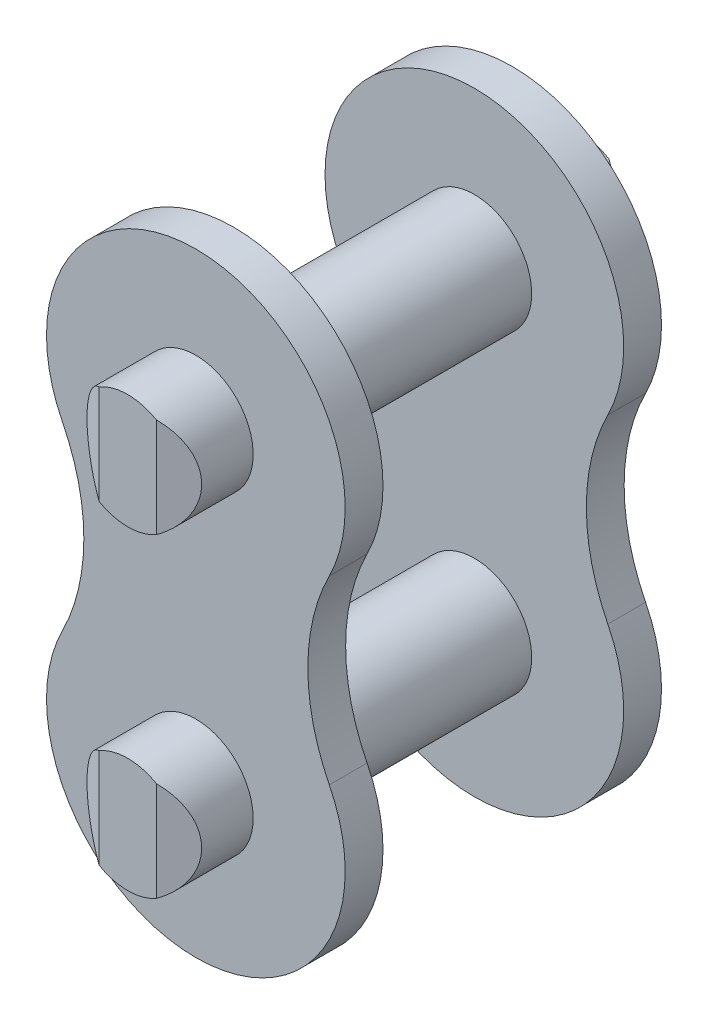
ISO-10303-21;
HEADER;
FILE_DESCRIPTION(('STEP AP214'),'2;1');
FILE_NAME('part.step','',(''),(''),'','','');
FILE_SCHEMA(('AUTOMOTIVE_DESIGN { 1 0 10303 214 1 1 1 1 }'));
ENDSEC;
DATA;
#1=APPLICATION_CONTEXT('core data for automotive mechanical design processes');
#2=APPLICATION_PROTOCOL_DEFINITION('international standard','automotive_design',2000,#1);
#3=PRODUCT_CONTEXT('',#1,'mechanical');
#4=PRODUCT('Part','Part','',(#3));
#5=PRODUCT_RELATED_PRODUCT_CATEGORY('part','',(#4));
#6=PRODUCT_DEFINITION_FORMATION('','',#4);
#7=PRODUCT_DEFINITION_CONTEXT('part definition',#1,'design');
#8=PRODUCT_DEFINITION('design','',#6,#7);
#9=PRODUCT_DEFINITION_SHAPE('','',#8);
#10=(LENGTH_UNIT() NAMED_UNIT(*) SI_UNIT(.MILLI.,.METRE.));
#11=(NAMED_UNIT(*) PLANE_ANGLE_UNIT() SI_UNIT($,.RADIAN.));
#12=(NAMED_UNIT(*) SI_UNIT($,.STERADIAN.) SOLID_ANGLE_UNIT());
#13=UNCERTAINTY_MEASURE_WITH_UNIT(LENGTH_MEASURE(1.E-05),#10,'distance_accuracy_value','');
#14=(GEOMETRIC_REPRESENTATION_CONTEXT(3) GLOBAL_UNCERTAINTY_ASSIGNED_CONTEXT((#13)) GLOBAL_UNIT_ASSIGNED_CONTEXT((#10,
#11,#12)) REPRESENTATION_CONTEXT('',''));
#15=CARTESIAN_POINT('',(0.,0.,0.));
#16=DIRECTION('',(0.,0.,1.));
#17=DIRECTION('',(1.,0.,0.));
#18=AXIS2_PLACEMENT_3D('',#15,#16,#17);
#19=CARTESIAN_POINT('',(133.975475000006,224.252155414286,-131.392489073474));
#20=DIRECTION('',(-0.5,0.,0.866025403784439));
#21=DIRECTION('',(0.,1.,0.));
#22=AXIS2_PLACEMENT_3D('',#19,#20,#21);
#23=PLANE('',#22);
#24=CARTESIAN_POINT('',(133.108700000007,209.749496563336,-131.892921853051));
#25=DIRECTION('',(0.5,0.,-0.866025403784439));
#26=DIRECTION('',(0.866025403784439,0.,0.5));
#27=AXIS2_PLACEMENT_3D('',#24,#25,#26);
#28=ELLIPSE('',#27,1.3344874122049,1.1557);
#29=CARTESIAN_POINT('',(133.686550000007,210.750362122491,-131.5593));
#30=VERTEX_POINT('',#29);
#31=CARTESIAN_POINT('',(133.686550000007,208.748631004183,-131.5593));
#32=VERTEX_POINT('',#31);
#33=EDGE_CURVE('E291',#30,#32,#28,.T.);
#34=ORIENTED_EDGE('',*,*,#33,.T.);
#35=DIRECTION('',(0.,-1.,0.));
#36=VECTOR('',#35,1.);
#37=CARTESIAN_POINT('',(133.686550000007,224.252155414286,-131.5593));
#38=LINE('',#37,#36);
#39=EDGE_CURVE('E245',#30,#32,#38,.T.);
#40=ORIENTED_EDGE('',*,*,#39,.F.);
#41=EDGE_LOOP('',(#34,#40));
#42=FACE_BOUND('',#41,.T.);
#43=ADVANCED_FACE('F17',(#42),#23,.F.);
#44=CARTESIAN_POINT('',(132.241925000006,224.252155414286,-131.392489073474));
#45=DIRECTION('',(-0.5,0.,-0.866025403784439));
#46=DIRECTION('',(-0.866025403784439,0.,0.5));
#47=AXIS2_PLACEMENT_3D('',#44,#45,#46);
#48=PLANE('',#47);
#49=CARTESIAN_POINT('',(133.108700000007,209.749496563336,-131.892921853051));
#50=DIRECTION('',(0.5,0.,0.866025403784439));
#51=DIRECTION('',(-0.866025403784439,0.,0.5));
#52=AXIS2_PLACEMENT_3D('',#49,#50,#51);
#53=ELLIPSE('',#52,1.3344874122049,1.1557);
#54=CARTESIAN_POINT('',(132.530850000007,210.750362122491,-131.5593));
#55=VERTEX_POINT('',#54);
#56=CARTESIAN_POINT('',(132.530850000007,208.748631004183,-131.5593));
#57=VERTEX_POINT('',#56);
#58=EDGE_CURVE('E299',#55,#57,#53,.T.);
#59=ORIENTED_EDGE('',*,*,#58,.F.);
#60=DIRECTION('',(0.,-1.,0.));
#61=VECTOR('',#60,1.);
#62=CARTESIAN_POINT('',(132.530850000007,224.252155414286,-131.5593));
#63=LINE('',#62,#61);
#64=EDGE_CURVE('E248',#55,#57,#63,.T.);
#65=ORIENTED_EDGE('',*,*,#64,.T.);
#66=EDGE_LOOP('',(#59,#65));
#67=FACE_BOUND('',#66,.T.);
#68=ADVANCED_FACE('F387',(#67),#48,.T.);
#69=CARTESIAN_POINT('',(133.975475000006,224.252155414286,-131.392489073474));
#70=DIRECTION('',(-0.5,0.,0.866025403784439));
#71=DIRECTION('',(0.,1.,0.));
#72=AXIS2_PLACEMENT_3D('',#69,#70,#71);
#73=PLANE('',#72);
#74=CARTESIAN_POINT('',(133.108700000007,203.399496563337,-131.892921853051));
#75=DIRECTION('',(0.5,0.,-0.866025403784439));
#76=DIRECTION('',(0.866025403784439,0.,0.5));
#77=AXIS2_PLACEMENT_3D('',#74,#75,#76);
#78=ELLIPSE('',#77,1.3344874122049,1.1557);
#79=CARTESIAN_POINT('',(133.686550000007,204.400362122491,-131.5593));
#80=VERTEX_POINT('',#79);
#81=CARTESIAN_POINT('',(133.686550000007,202.398631004183,-131.5593));
#82=VERTEX_POINT('',#81);
#83=EDGE_CURVE('E309',#80,#82,#78,.T.);
#84=ORIENTED_EDGE('',*,*,#83,.T.);
#85=DIRECTION('',(0.,-1.,0.));
#86=VECTOR('',#85,1.);
#87=CARTESIAN_POINT('',(133.686550000007,224.252155414286,-131.5593));
#88=LINE('',#87,#86);
#89=EDGE_CURVE('E319',#80,#82,#88,.T.);
#90=ORIENTED_EDGE('',*,*,#89,.F.);
#91=EDGE_LOOP('',(#84,#90));
#92=FACE_BOUND('',#91,.T.);
#93=ADVANCED_FACE('F393',(#92),#73,.F.);
#94=CARTESIAN_POINT('',(132.241925000006,224.252155414286,-131.392489073474));
#95=DIRECTION('',(-0.5,0.,-0.866025403784439));
#96=DIRECTION('',(-0.866025403784439,0.,0.5));
#97=AXIS2_PLACEMENT_3D('',#94,#95,#96);
#98=PLANE('',#97);
#99=CARTESIAN_POINT('',(133.108700000007,203.399496563337,-131.892921853051));
#100=DIRECTION('',(0.5,0.,0.866025403784439));
#101=DIRECTION('',(-0.866025403784439,0.,0.5));
#102=AXIS2_PLACEMENT_3D('',#99,#100,#101);
#103=ELLIPSE('',#102,1.3344874122049,1.1557);
#104=CARTESIAN_POINT('',(132.530850000007,204.400362122491,-131.5593));
#105=VERTEX_POINT('',#104);
#106=CARTESIAN_POINT('',(132.530850000007,202.398631004183,-131.5593));
#107=VERTEX_POINT('',#106);
#108=EDGE_CURVE('E310',#105,#107,#103,.T.);
#109=ORIENTED_EDGE('',*,*,#108,.F.);
#110=DIRECTION('',(0.,-1.,0.));
#111=VECTOR('',#110,1.);
#112=CARTESIAN_POINT('',(132.530850000007,224.252155414286,-131.5593));
#113=LINE('',#112,#111);
#114=EDGE_CURVE('E322',#105,#107,#113,.T.);
#115=ORIENTED_EDGE('',*,*,#114,.T.);
#116=EDGE_LOOP('',(#109,#115));
#117=FACE_BOUND('',#116,.T.);
#118=ADVANCED_FACE('F382',(#117),#98,.T.);
#119=CARTESIAN_POINT('',(133.108700000007,206.574496563337,-129.4257));
#120=DIRECTION('',(0.,0.,-1.));
#121=DIRECTION('',(0.,-1.,0.));
#122=AXIS2_PLACEMENT_3D('',#119,#120,#121);
#123=PLANE('',#122);
#124=CARTESIAN_POINT('',(133.108700000007,209.749496563336,-129.4257));
#125=DIRECTION('',(0.,0.,1.));
#126=DIRECTION('',(0.,-1.,0.));
#127=AXIS2_PLACEMENT_3D('',#124,#125,#126);
#128=CIRCLE('',#127,1.1557);
#129=CARTESIAN_POINT('',(133.108700000007,208.593796563336,-129.4257));
#130=VERTEX_POINT('',#129);
#131=EDGE_CURVE('E254',#130,#130,#128,.T.);
#132=ORIENTED_EDGE('',*,*,#131,.F.);
#133=EDGE_LOOP('',(#132));
#134=FACE_BOUND('',#133,.T.);
#135=CARTESIAN_POINT('',(133.108700000007,203.399496563337,-129.4257));
#136=DIRECTION('',(0.,0.,1.));
#137=DIRECTION('',(0.,-1.,0.));
#138=AXIS2_PLACEMENT_3D('',#135,#136,#137);
#139=CIRCLE('',#138,1.1557);
#140=CARTESIAN_POINT('',(133.108700000007,202.243796563336,-129.4257));
#141=VERTEX_POINT('',#140);
#142=EDGE_CURVE('E258',#141,#141,#139,.T.);
#143=ORIENTED_EDGE('',*,*,#142,.F.);
#144=EDGE_LOOP('',(#143));
#145=FACE_BOUND('',#144,.T.);
#146=CARTESIAN_POINT('',(126.78662526372,206.574496563337,-129.4257));
#147=DIRECTION('',(0.,0.,1.));
#148=DIRECTION('',(0.,-1.,0.));
#149=AXIS2_PLACEMENT_3D('',#146,#147,#148);
#150=CIRCLE('',#149,4.06464973628698);
#151=CARTESIAN_POINT('',(130.418943979048,204.750315040304,-129.4257));
#152=VERTEX_POINT('',#151);
#153=CARTESIAN_POINT('',(130.418943979048,208.398678086369,-129.4257));
#154=VERTEX_POINT('',#153);
#155=EDGE_CURVE('E325',#152,#154,#150,.T.);
#156=ORIENTED_EDGE('',*,*,#155,.F.);
#157=CARTESIAN_POINT('',(133.108700000007,203.399496563337,-129.4257));
#158=DIRECTION('',(0.,0.,1.));
#159=DIRECTION('',(0.,-1.,0.));
#160=AXIS2_PLACEMENT_3D('',#157,#158,#159);
#161=CIRCLE('',#160,3.0099);
#162=CARTESIAN_POINT('',(135.798456020965,204.750315040304,-129.4257));
#163=VERTEX_POINT('',#162);
#164=EDGE_CURVE('E339',#152,#163,#161,.T.);
#165=ORIENTED_EDGE('',*,*,#164,.T.);
#166=CARTESIAN_POINT('',(139.430774736293,206.574496563337,-129.4257));
#167=DIRECTION('',(0.,0.,1.));
#168=DIRECTION('',(0.,-1.,0.));
#169=AXIS2_PLACEMENT_3D('',#166,#167,#168);
#170=CIRCLE('',#169,4.06464973628691);
#171=CARTESIAN_POINT('',(135.798456020965,208.398678086369,-129.4257));
#172=VERTEX_POINT('',#171);
#173=EDGE_CURVE('E240',#172,#163,#170,.T.);
#174=ORIENTED_EDGE('',*,*,#173,.F.);
#175=CARTESIAN_POINT('',(133.108700000007,209.749496563336,-129.4257));
#176=DIRECTION('',(0.,0.,1.));
#177=DIRECTION('',(0.,-1.,0.));
#178=AXIS2_PLACEMENT_3D('',#175,#176,#177);
#179=CIRCLE('',#178,3.0099);
#180=EDGE_CURVE('E25',#172,#154,#179,.T.);
#181=ORIENTED_EDGE('',*,*,#180,.T.);
#182=EDGE_LOOP('',(#156,#165,#174,#181));
#183=FACE_BOUND('',#182,.T.);
#184=ADVANCED_FACE('F359',(#134,#145,#183),#123,.F.);
#185=CARTESIAN_POINT('',(133.108700000007,206.574496563337,-130.1877));
#186=DIRECTION('',(0.,0.,-1.));
#187=DIRECTION('',(0.,-1.,0.));
#188=AXIS2_PLACEMENT_3D('',#185,#186,#187);
#189=PLANE('',#188);
#190=CARTESIAN_POINT('',(133.108700000007,209.749496563336,-130.1877));
#191=DIRECTION('',(0.,0.,1.));
#192=DIRECTION('',(0.,-1.,0.));
#193=AXIS2_PLACEMENT_3D('',#190,#191,#192);
#194=CIRCLE('',#193,1.1557);
#195=CARTESIAN_POINT('',(133.108700000007,208.593796563336,-130.1877));
#196=VERTEX_POINT('',#195);
#197=EDGE_CURVE('E257',#196,#196,#194,.T.);
#198=ORIENTED_EDGE('',*,*,#197,.T.);
#199=EDGE_LOOP('',(#198));
#200=FACE_BOUND('',#199,.T.);
#201=CARTESIAN_POINT('',(133.108700000007,203.399496563337,-130.1877));
#202=DIRECTION('',(0.,0.,1.));
#203=DIRECTION('',(0.,-1.,0.));
#204=AXIS2_PLACEMENT_3D('',#201,#202,#203);
#205=CIRCLE('',#204,1.1557);
#206=CARTESIAN_POINT('',(133.108700000007,202.243796563336,-130.1877));
#207=VERTEX_POINT('',#206);
#208=EDGE_CURVE('E306',#207,#207,#205,.T.);
#209=ORIENTED_EDGE('',*,*,#208,.T.);
#210=EDGE_LOOP('',(#209));
#211=FACE_BOUND('',#210,.T.);
#212=CARTESIAN_POINT('',(126.78662526372,206.574496563337,-130.1877));
#213=DIRECTION('',(0.,0.,1.));
#214=DIRECTION('',(0.,-1.,0.));
#215=AXIS2_PLACEMENT_3D('',#212,#213,#214);
#216=CIRCLE('',#215,4.06464973628698);
#217=CARTESIAN_POINT('',(130.418943979048,204.750315040304,-130.1877));
#218=VERTEX_POINT('',#217);
#219=CARTESIAN_POINT('',(130.418943979048,208.398678086369,-130.1877));
#220=VERTEX_POINT('',#219);
#221=EDGE_CURVE('E332',#218,#220,#216,.T.);
#222=ORIENTED_EDGE('',*,*,#221,.T.);
#223=CARTESIAN_POINT('',(133.108700000007,209.749496563336,-130.1877));
#224=DIRECTION('',(0.,0.,1.));
#225=DIRECTION('',(0.,-1.,0.));
#226=AXIS2_PLACEMENT_3D('',#223,#224,#225);
#227=CIRCLE('',#226,3.0099);
#228=CARTESIAN_POINT('',(135.798456020965,208.398678086369,-130.1877));
#229=VERTEX_POINT('',#228);
#230=EDGE_CURVE('E11',#229,#220,#227,.T.);
#231=ORIENTED_EDGE('',*,*,#230,.F.);
#232=CARTESIAN_POINT('',(139.430774736293,206.574496563337,-130.1877));
#233=DIRECTION('',(0.,0.,1.));
#234=DIRECTION('',(0.,-1.,0.));
#235=AXIS2_PLACEMENT_3D('',#232,#233,#234);
#236=CIRCLE('',#235,4.06464973628691);
#237=CARTESIAN_POINT('',(135.798456020965,204.750315040304,-130.1877));
#238=VERTEX_POINT('',#237);
#239=EDGE_CURVE('E243',#229,#238,#236,.T.);
#240=ORIENTED_EDGE('',*,*,#239,.T.);
#241=CARTESIAN_POINT('',(133.108700000007,203.399496563337,-130.1877));
#242=DIRECTION('',(0.,0.,1.));
#243=DIRECTION('',(0.,-1.,0.));
#244=AXIS2_PLACEMENT_3D('',#241,#242,#243);
#245=CIRCLE('',#244,3.0099);
#246=EDGE_CURVE('E343',#218,#238,#245,.T.);
#247=ORIENTED_EDGE('',*,*,#246,.F.);
#248=EDGE_LOOP('',(#222,#231,#240,#247));
#249=FACE_BOUND('',#248,.T.);
#250=ADVANCED_FACE('F372',(#200,#211,#249),#189,.T.);
#251=CARTESIAN_POINT('',(133.108700000007,209.749496563336,-130.1877));
#252=DIRECTION('',(0.,0.,1.));
#253=DIRECTION('',(0.,1.,0.));
#254=AXIS2_PLACEMENT_3D('',#251,#252,#253);
#255=CYLINDRICAL_SURFACE('',#254,3.0099);
#256=ORIENTED_EDGE('',*,*,#180,.F.);
#257=DIRECTION('',(0.,0.,1.));
#258=VECTOR('',#257,1.);
#259=CARTESIAN_POINT('',(135.798456020965,208.398678086369,-130.1877));
#260=LINE('',#259,#258);
#261=EDGE_CURVE('E352',#229,#172,#260,.T.);
#262=ORIENTED_EDGE('',*,*,#261,.F.);
#263=ORIENTED_EDGE('',*,*,#230,.T.);
#264=DIRECTION('',(0.,0.,1.));
#265=VECTOR('',#264,1.);
#266=CARTESIAN_POINT('',(130.418943979048,208.398678086369,-130.1877));
#267=LINE('',#266,#265);
#268=EDGE_CURVE('E329',#220,#154,#267,.T.);
#269=ORIENTED_EDGE('',*,*,#268,.T.);
#270=EDGE_LOOP('',(#256,#262,#263,#269));
#271=FACE_BOUND('',#270,.T.);
#272=ADVANCED_FACE('F361',(#271),#255,.T.);
#273=CARTESIAN_POINT('',(139.430774736293,206.574496563337,-130.1877));
#274=DIRECTION('',(0.,0.,1.));
#275=DIRECTION('',(0.,1.,0.));
#276=AXIS2_PLACEMENT_3D('',#273,#274,#275);
#277=CYLINDRICAL_SURFACE('',#276,4.06464973628691);
#278=ORIENTED_EDGE('',*,*,#173,.T.);
#279=DIRECTION('',(0.,0.,1.));
#280=VECTOR('',#279,1.);
#281=CARTESIAN_POINT('',(135.798456020965,204.750315040304,-130.1877));
#282=LINE('',#281,#280);
#283=EDGE_CURVE('E244',#238,#163,#282,.T.);
#284=ORIENTED_EDGE('',*,*,#283,.F.);
#285=ORIENTED_EDGE('',*,*,#239,.F.);
#286=ORIENTED_EDGE('',*,*,#261,.T.);
#287=EDGE_LOOP('',(#278,#284,#285,#286));
#288=FACE_BOUND('',#287,.T.);
#289=ADVANCED_FACE('F371',(#288),#277,.F.);
#290=CARTESIAN_POINT('',(133.108700000007,203.399496563337,-130.1877));
#291=DIRECTION('',(0.,0.,1.));
#292=DIRECTION('',(0.,1.,0.));
#293=AXIS2_PLACEMENT_3D('',#290,#291,#292);
#294=CYLINDRICAL_SURFACE('',#293,3.0099);
#295=ORIENTED_EDGE('',*,*,#164,.F.);
#296=DIRECTION('',(0.,0.,1.));
#297=VECTOR('',#296,1.);
#298=CARTESIAN_POINT('',(130.418943979048,204.750315040304,-130.1877));
#299=LINE('',#298,#297);
#300=EDGE_CURVE('E335',#218,#152,#299,.T.);
#301=ORIENTED_EDGE('',*,*,#300,.F.);
#302=ORIENTED_EDGE('',*,*,#246,.T.);
#303=ORIENTED_EDGE('',*,*,#283,.T.);
#304=EDGE_LOOP('',(#295,#301,#302,#303));
#305=FACE_BOUND('',#304,.T.);
#306=ADVANCED_FACE('F367',(#305),#294,.T.);
#307=CARTESIAN_POINT('',(126.78662526372,206.574496563337,-130.1877));
#308=DIRECTION('',(0.,0.,1.));
#309=DIRECTION('',(0.,1.,0.));
#310=AXIS2_PLACEMENT_3D('',#307,#308,#309);
#311=CYLINDRICAL_SURFACE('',#310,4.06464973628698);
#312=ORIENTED_EDGE('',*,*,#155,.T.);
#313=ORIENTED_EDGE('',*,*,#268,.F.);
#314=ORIENTED_EDGE('',*,*,#221,.F.);
#315=ORIENTED_EDGE('',*,*,#300,.T.);
#316=EDGE_LOOP('',(#312,#313,#314,#315));
#317=FACE_BOUND('',#316,.T.);
#318=ADVANCED_FACE('F364',(#317),#311,.F.);
#319=CARTESIAN_POINT('',(133.108700000007,206.574496563337,-131.5593));
#320=DIRECTION('',(0.,0.,-1.));
#321=DIRECTION('',(0.,-1.,0.));
#322=AXIS2_PLACEMENT_3D('',#319,#320,#321);
#323=PLANE('',#322);
#324=ORIENTED_EDGE('',*,*,#89,.T.);
#325=CARTESIAN_POINT('',(133.108700000007,203.399496563337,-131.5593));
#326=DIRECTION('',(0.,0.,1.));
#327=DIRECTION('',(0.,-1.,0.));
#328=AXIS2_PLACEMENT_3D('',#325,#326,#327);
#329=CIRCLE('',#328,1.1557);
#330=EDGE_CURVE('E314',#107,#82,#329,.T.);
#331=ORIENTED_EDGE('',*,*,#330,.F.);
#332=ORIENTED_EDGE('',*,*,#114,.F.);
#333=CARTESIAN_POINT('',(133.108700000007,203.399496563337,-131.5593));
#334=DIRECTION('',(0.,0.,1.));
#335=DIRECTION('',(0.,-1.,0.));
#336=AXIS2_PLACEMENT_3D('',#333,#334,#335);
#337=CIRCLE('',#336,1.1557);
#338=EDGE_CURVE('E315',#80,#105,#337,.T.);
#339=ORIENTED_EDGE('',*,*,#338,.F.);
#340=EDGE_LOOP('',(#324,#331,#332,#339));
#341=FACE_BOUND('',#340,.T.);
#342=ADVANCED_FACE('F509',(#341),#323,.T.);
#343=CARTESIAN_POINT('',(133.108700000007,203.399496563337,-131.5593));
#344=DIRECTION('',(0.,0.,1.));
#345=DIRECTION('',(0.,1.,0.));
#346=AXIS2_PLACEMENT_3D('',#343,#344,#345);
#347=CYLINDRICAL_SURFACE('',#346,1.1557);
#348=ORIENTED_EDGE('',*,*,#83,.F.);
#349=ORIENTED_EDGE('',*,*,#338,.T.);
#350=ORIENTED_EDGE('',*,*,#108,.T.);
#351=ORIENTED_EDGE('',*,*,#330,.T.);
#352=EDGE_LOOP('',(#348,#349,#350,#351));
#353=FACE_BOUND('',#352,.T.);
#354=ORIENTED_EDGE('',*,*,#208,.F.);
#355=EDGE_LOOP('',(#354));
#356=FACE_BOUND('',#355,.T.);
#357=ADVANCED_FACE('F506',(#353,#356),#347,.T.);
#358=CARTESIAN_POINT('',(133.108700000007,206.574496563337,-131.5593));
#359=DIRECTION('',(0.,0.,-1.));
#360=DIRECTION('',(0.,-1.,0.));
#361=AXIS2_PLACEMENT_3D('',#358,#359,#360);
#362=PLANE('',#361);
#363=ORIENTED_EDGE('',*,*,#39,.T.);
#364=CARTESIAN_POINT('',(133.108700000007,209.749496563336,-131.5593));
#365=DIRECTION('',(0.,0.,1.));
#366=DIRECTION('',(0.,-1.,0.));
#367=AXIS2_PLACEMENT_3D('',#364,#365,#366);
#368=CIRCLE('',#367,1.1557);
#369=EDGE_CURVE('E249',#57,#32,#368,.T.);
#370=ORIENTED_EDGE('',*,*,#369,.F.);
#371=ORIENTED_EDGE('',*,*,#64,.F.);
#372=CARTESIAN_POINT('',(133.108700000007,209.749496563336,-131.5593));
#373=DIRECTION('',(0.,0.,1.));
#374=DIRECTION('',(0.,-1.,0.));
#375=AXIS2_PLACEMENT_3D('',#372,#373,#374);
#376=CIRCLE('',#375,1.1557);
#377=EDGE_CURVE('E295',#30,#55,#376,.T.);
#378=ORIENTED_EDGE('',*,*,#377,.F.);
#379=EDGE_LOOP('',(#363,#370,#371,#378));
#380=FACE_BOUND('',#379,.T.);
#381=ADVANCED_FACE('F404',(#380),#362,.T.);
#382=CARTESIAN_POINT('',(133.108700000007,209.749496563336,-131.5593));
#383=DIRECTION('',(0.,0.,1.));
#384=DIRECTION('',(0.,1.,0.));
#385=AXIS2_PLACEMENT_3D('',#382,#383,#384);
#386=CYLINDRICAL_SURFACE('',#385,1.1557);
#387=ORIENTED_EDGE('',*,*,#33,.F.);
#388=ORIENTED_EDGE('',*,*,#377,.T.);
#389=ORIENTED_EDGE('',*,*,#58,.T.);
#390=ORIENTED_EDGE('',*,*,#369,.T.);
#391=EDGE_LOOP('',(#387,#388,#389,#390));
#392=FACE_BOUND('',#391,.T.);
#393=ORIENTED_EDGE('',*,*,#197,.F.);
#394=EDGE_LOOP('',(#393));
#395=FACE_BOUND('',#394,.T.);
#396=ADVANCED_FACE('F399',(#392,#395),#386,.T.);
#397=CARTESIAN_POINT('',(133.975475000006,224.252155414286,-122.607510926526));
#398=DIRECTION('',(-0.5,0.,-0.866025403784439));
#399=DIRECTION('',(-0.866025403784439,0.,0.5));
#400=AXIS2_PLACEMENT_3D('',#397,#398,#399);
#401=PLANE('',#400);
#402=CARTESIAN_POINT('',(133.108700000007,209.749496563336,-122.107078146949));
#403=DIRECTION('',(-0.5,0.,-0.866025403784439));
#404=DIRECTION('',(0.866025403784439,0.,-0.5));
#405=AXIS2_PLACEMENT_3D('',#402,#403,#404);
#406=ELLIPSE('',#405,1.3344874122049,1.1557);
#407=CARTESIAN_POINT('',(133.686550000007,210.750362122491,-122.4407));
#408=VERTEX_POINT('',#407);
#409=CARTESIAN_POINT('',(133.686550000007,208.748631004183,-122.4407));
#410=VERTEX_POINT('',#409);
#411=EDGE_CURVE('E415',#408,#410,#406,.T.);
#412=ORIENTED_EDGE('',*,*,#411,.F.);
#413=DIRECTION('',(0.,-1.,0.));
#414=VECTOR('',#413,1.);
#415=CARTESIAN_POINT('',(133.686550000007,224.252155414286,-122.4407));
#416=LINE('',#415,#414);
#417=EDGE_CURVE('E434',#408,#410,#416,.T.);
#418=ORIENTED_EDGE('',*,*,#417,.T.);
#419=EDGE_LOOP('',(#412,#418));
#420=FACE_BOUND('',#419,.T.);
#421=ADVANCED_FACE('F497',(#420),#401,.F.);
#422=CARTESIAN_POINT('',(132.241925000006,224.252155414286,-122.607510926526));
#423=DIRECTION('',(-0.5,0.,0.866025403784439));
#424=DIRECTION('',(0.,1.,0.));
#425=AXIS2_PLACEMENT_3D('',#422,#423,#424);
#426=PLANE('',#425);
#427=CARTESIAN_POINT('',(133.108700000007,209.749496563336,-122.107078146949));
#428=DIRECTION('',(-0.5,0.,0.866025403784439));
#429=DIRECTION('',(-0.866025403784439,0.,-0.5));
#430=AXIS2_PLACEMENT_3D('',#427,#428,#429);
#431=ELLIPSE('',#430,1.3344874122049,1.1557);
#432=CARTESIAN_POINT('',(132.530850000007,210.750362122491,-122.4407));
#433=VERTEX_POINT('',#432);
#434=CARTESIAN_POINT('',(132.530850000007,208.748631004183,-122.4407));
#435=VERTEX_POINT('',#434);
#436=EDGE_CURVE('E419',#433,#435,#431,.T.);
#437=ORIENTED_EDGE('',*,*,#436,.T.);
#438=DIRECTION('',(0.,-1.,0.));
#439=VECTOR('',#438,1.);
#440=CARTESIAN_POINT('',(132.530850000007,224.252155414286,-122.4407));
#441=LINE('',#440,#439);
#442=EDGE_CURVE('E427',#433,#435,#441,.T.);
#443=ORIENTED_EDGE('',*,*,#442,.F.);
#444=EDGE_LOOP('',(#437,#443));
#445=FACE_BOUND('',#444,.T.);
#446=ADVANCED_FACE('F500',(#445),#426,.T.);
#447=CARTESIAN_POINT('',(133.975475000006,224.252155414286,-122.607510926526));
#448=DIRECTION('',(-0.5,0.,-0.866025403784439));
#449=DIRECTION('',(-0.866025403784439,0.,0.5));
#450=AXIS2_PLACEMENT_3D('',#447,#448,#449);
#451=PLANE('',#450);
#452=CARTESIAN_POINT('',(133.108700000007,203.399496563337,-122.107078146949));
#453=DIRECTION('',(-0.5,0.,-0.866025403784439));
#454=DIRECTION('',(0.866025403784439,0.,-0.5));
#455=AXIS2_PLACEMENT_3D('',#452,#453,#454);
#456=ELLIPSE('',#455,1.3344874122049,1.1557);
#457=CARTESIAN_POINT('',(133.686550000007,204.400362122491,-122.4407));
#458=VERTEX_POINT('',#457);
#459=CARTESIAN_POINT('',(133.686550000007,202.398631004183,-122.4407));
#460=VERTEX_POINT('',#459);
#461=EDGE_CURVE('E224',#458,#460,#456,.T.);
#462=ORIENTED_EDGE('',*,*,#461,.F.);
#463=DIRECTION('',(0.,-1.,0.));
#464=VECTOR('',#463,1.);
#465=CARTESIAN_POINT('',(133.686550000007,224.252155414286,-122.4407));
#466=LINE('',#465,#464);
#467=EDGE_CURVE('E206',#458,#460,#466,.T.);
#468=ORIENTED_EDGE('',*,*,#467,.T.);
#469=EDGE_LOOP('',(#462,#468));
#470=FACE_BOUND('',#469,.T.);
#471=ADVANCED_FACE('F496',(#470),#451,.F.);
#472=CARTESIAN_POINT('',(132.241925000006,224.252155414286,-122.607510926526));
#473=DIRECTION('',(-0.5,0.,0.866025403784439));
#474=DIRECTION('',(0.,1.,0.));
#475=AXIS2_PLACEMENT_3D('',#472,#473,#474);
#476=PLANE('',#475);
#477=CARTESIAN_POINT('',(133.108700000007,203.399496563337,-122.107078146949));
#478=DIRECTION('',(-0.5,0.,0.866025403784439));
#479=DIRECTION('',(-0.866025403784439,0.,-0.5));
#480=AXIS2_PLACEMENT_3D('',#477,#478,#479);
#481=ELLIPSE('',#480,1.3344874122049,1.1557);
#482=CARTESIAN_POINT('',(132.530850000007,204.400362122491,-122.4407));
#483=VERTEX_POINT('',#482);
#484=CARTESIAN_POINT('',(132.530850000007,202.398631004183,-122.4407));
#485=VERTEX_POINT('',#484);
#486=EDGE_CURVE('E200',#483,#485,#481,.T.);
#487=ORIENTED_EDGE('',*,*,#486,.T.);
#488=DIRECTION('',(0.,-1.,0.));
#489=VECTOR('',#488,1.);
#490=CARTESIAN_POINT('',(132.530850000007,224.252155414286,-122.4407));
#491=LINE('',#490,#489);
#492=EDGE_CURVE('E196',#483,#485,#491,.T.);
#493=ORIENTED_EDGE('',*,*,#492,.F.);
#494=EDGE_LOOP('',(#487,#493));
#495=FACE_BOUND('',#494,.T.);
#496=ADVANCED_FACE('F198',(#495),#476,.T.);
#497=CARTESIAN_POINT('',(133.108700000007,209.749496563336,-122.4407));
#498=DIRECTION('',(0.,0.,-1.));
#499=DIRECTION('',(0.,1.,0.));
#500=AXIS2_PLACEMENT_3D('',#497,#498,#499);
#501=CYLINDRICAL_SURFACE('',#500,1.1557);
#502=ORIENTED_EDGE('',*,*,#131,.T.);
#503=EDGE_LOOP('',(#502));
#504=FACE_BOUND('',#503,.T.);
#505=CARTESIAN_POINT('',(133.108700000007,209.749496563336,-124.5743));
#506=DIRECTION('',(0.,0.,1.));
#507=DIRECTION('',(0.,-1.,0.));
#508=AXIS2_PLACEMENT_3D('',#505,#506,#507);
#509=CIRCLE('',#508,1.1557);
#510=CARTESIAN_POINT('',(133.108700000007,208.593796563336,-124.5743));
#511=VERTEX_POINT('',#510);
#512=EDGE_CURVE('E284',#511,#511,#509,.T.);
#513=ORIENTED_EDGE('',*,*,#512,.F.);
#514=EDGE_LOOP('',(#513));
#515=FACE_BOUND('',#514,.T.);
#516=ADVANCED_FACE('F489',(#504,#515),#501,.T.);
#517=CARTESIAN_POINT('',(133.108700000007,203.399496563337,-122.4407));
#518=DIRECTION('',(0.,0.,-1.));
#519=DIRECTION('',(0.,1.,0.));
#520=AXIS2_PLACEMENT_3D('',#517,#518,#519);
#521=CYLINDRICAL_SURFACE('',#520,1.1557);
#522=ORIENTED_EDGE('',*,*,#142,.T.);
#523=EDGE_LOOP('',(#522));
#524=FACE_BOUND('',#523,.T.);
#525=CARTESIAN_POINT('',(133.108700000007,203.399496563337,-124.5743));
#526=DIRECTION('',(0.,0.,1.));
#527=DIRECTION('',(0.,-1.,0.));
#528=AXIS2_PLACEMENT_3D('',#525,#526,#527);
#529=CIRCLE('',#528,1.1557);
#530=CARTESIAN_POINT('',(133.108700000007,202.243796563336,-124.5743));
#531=VERTEX_POINT('',#530);
#532=EDGE_CURVE('E281',#531,#531,#529,.T.);
#533=ORIENTED_EDGE('',*,*,#532,.F.);
#534=EDGE_LOOP('',(#533));
#535=FACE_BOUND('',#534,.T.);
#536=ADVANCED_FACE('F485',(#524,#535),#521,.T.);
#537=CARTESIAN_POINT('',(133.108700000007,206.574496563337,-124.5743));
#538=DIRECTION('',(0.,0.,1.));
#539=DIRECTION('',(1.,0.,0.));
#540=AXIS2_PLACEMENT_3D('',#537,#538,#539);
#541=PLANE('',#540);
#542=ORIENTED_EDGE('',*,*,#512,.T.);
#543=EDGE_LOOP('',(#542));
#544=FACE_BOUND('',#543,.T.);
#545=ORIENTED_EDGE('',*,*,#532,.T.);
#546=EDGE_LOOP('',(#545));
#547=FACE_BOUND('',#546,.T.);
#548=CARTESIAN_POINT('',(126.78662526372,206.574496563337,-124.5743));
#549=DIRECTION('',(0.,0.,1.));
#550=DIRECTION('',(0.,-1.,0.));
#551=AXIS2_PLACEMENT_3D('',#548,#549,#550);
#552=CIRCLE('',#551,4.06464973628698);
#553=CARTESIAN_POINT('',(130.418943979048,204.750315040304,-124.5743));
#554=VERTEX_POINT('',#553);
#555=CARTESIAN_POINT('',(130.418943979048,208.398678086369,-124.5743));
#556=VERTEX_POINT('',#555);
#557=EDGE_CURVE('E205',#554,#556,#552,.T.);
#558=ORIENTED_EDGE('',*,*,#557,.T.);
#559=CARTESIAN_POINT('',(133.108700000007,209.749496563336,-124.5743));
#560=DIRECTION('',(0.,0.,1.));
#561=DIRECTION('',(0.,-1.,0.));
#562=AXIS2_PLACEMENT_3D('',#559,#560,#561);
#563=CIRCLE('',#562,3.0099);
#564=CARTESIAN_POINT('',(135.798456020965,208.398678086369,-124.5743));
#565=VERTEX_POINT('',#564);
#566=EDGE_CURVE('E275',#565,#556,#563,.T.);
#567=ORIENTED_EDGE('',*,*,#566,.F.);
#568=CARTESIAN_POINT('',(139.430774736293,206.574496563337,-124.5743));
#569=DIRECTION('',(0.,0.,1.));
#570=DIRECTION('',(0.,-1.,0.));
#571=AXIS2_PLACEMENT_3D('',#568,#569,#570);
#572=CIRCLE('',#571,4.06464973628691);
#573=CARTESIAN_POINT('',(135.798456020965,204.750315040304,-124.5743));
#574=VERTEX_POINT('',#573);
#575=EDGE_CURVE('E227',#565,#574,#572,.T.);
#576=ORIENTED_EDGE('',*,*,#575,.T.);
#577=CARTESIAN_POINT('',(133.108700000007,203.399496563337,-124.5743));
#578=DIRECTION('',(0.,0.,1.));
#579=DIRECTION('',(0.,-1.,0.));
#580=AXIS2_PLACEMENT_3D('',#577,#578,#579);
#581=CIRCLE('',#580,3.0099);
#582=EDGE_CURVE('E253',#554,#574,#581,.T.);
#583=ORIENTED_EDGE('',*,*,#582,.F.);
#584=EDGE_LOOP('',(#558,#567,#576,#583));
#585=FACE_BOUND('',#584,.T.);
#586=ADVANCED_FACE('F459',(#544,#547,#585),#541,.F.);
#587=CARTESIAN_POINT('',(133.108700000007,206.574496563337,-123.8123));
#588=DIRECTION('',(0.,0.,1.));
#589=DIRECTION('',(1.,0.,0.));
#590=AXIS2_PLACEMENT_3D('',#587,#588,#589);
#591=PLANE('',#590);
#592=CARTESIAN_POINT('',(133.108700000007,209.749496563336,-123.8123));
#593=DIRECTION('',(0.,0.,1.));
#594=DIRECTION('',(0.,-1.,0.));
#595=AXIS2_PLACEMENT_3D('',#592,#593,#594);
#596=CIRCLE('',#595,1.1557);
#597=CARTESIAN_POINT('',(133.108700000007,208.593796563336,-123.8123));
#598=VERTEX_POINT('',#597);
#599=EDGE_CURVE('E413',#598,#598,#596,.T.);
#600=ORIENTED_EDGE('',*,*,#599,.F.);
#601=EDGE_LOOP('',(#600));
#602=FACE_BOUND('',#601,.T.);
#603=CARTESIAN_POINT('',(133.108700000007,203.399496563337,-123.8123));
#604=DIRECTION('',(0.,0.,1.));
#605=DIRECTION('',(0.,-1.,0.));
#606=AXIS2_PLACEMENT_3D('',#603,#604,#605);
#607=CIRCLE('',#606,1.1557);
#608=CARTESIAN_POINT('',(133.108700000007,202.243796563336,-123.8123));
#609=VERTEX_POINT('',#608);
#610=EDGE_CURVE('E424',#609,#609,#607,.T.);
#611=ORIENTED_EDGE('',*,*,#610,.F.);
#612=EDGE_LOOP('',(#611));
#613=FACE_BOUND('',#612,.T.);
#614=CARTESIAN_POINT('',(126.78662526372,206.574496563337,-123.8123));
#615=DIRECTION('',(0.,0.,1.));
#616=DIRECTION('',(0.,-1.,0.));
#617=AXIS2_PLACEMENT_3D('',#614,#615,#616);
#618=CIRCLE('',#617,4.06464973628698);
#619=CARTESIAN_POINT('',(130.418943979048,204.750315040304,-123.8123));
#620=VERTEX_POINT('',#619);
#621=CARTESIAN_POINT('',(130.418943979048,208.398678086369,-123.8123));
#622=VERTEX_POINT('',#621);
#623=EDGE_CURVE('E235',#620,#622,#618,.T.);
#624=ORIENTED_EDGE('',*,*,#623,.F.);
#625=CARTESIAN_POINT('',(133.108700000007,203.399496563337,-123.8123));
#626=DIRECTION('',(0.,0.,1.));
#627=DIRECTION('',(0.,-1.,0.));
#628=AXIS2_PLACEMENT_3D('',#625,#626,#627);
#629=CIRCLE('',#628,3.0099);
#630=CARTESIAN_POINT('',(135.798456020965,204.750315040304,-123.8123));
#631=VERTEX_POINT('',#630);
#632=EDGE_CURVE('E229',#620,#631,#629,.T.);
#633=ORIENTED_EDGE('',*,*,#632,.T.);
#634=CARTESIAN_POINT('',(139.430774736293,206.574496563337,-123.8123));
#635=DIRECTION('',(0.,0.,1.));
#636=DIRECTION('',(0.,-1.,0.));
#637=AXIS2_PLACEMENT_3D('',#634,#635,#636);
#638=CIRCLE('',#637,4.06464973628691);
#639=CARTESIAN_POINT('',(135.798456020965,208.398678086369,-123.8123));
#640=VERTEX_POINT('',#639);
#641=EDGE_CURVE('E272',#640,#631,#638,.T.);
#642=ORIENTED_EDGE('',*,*,#641,.F.);
#643=CARTESIAN_POINT('',(133.108700000007,209.749496563336,-123.8123));
#644=DIRECTION('',(0.,0.,1.));
#645=DIRECTION('',(0.,-1.,0.));
#646=AXIS2_PLACEMENT_3D('',#643,#644,#645);
#647=CIRCLE('',#646,3.0099);
#648=EDGE_CURVE('E278',#640,#622,#647,.T.);
#649=ORIENTED_EDGE('',*,*,#648,.T.);
#650=EDGE_LOOP('',(#624,#633,#642,#649));
#651=FACE_BOUND('',#650,.T.);
#652=ADVANCED_FACE('F466',(#602,#613,#651),#591,.T.);
#653=CARTESIAN_POINT('',(133.108700000007,209.749496563336,-123.8123));
#654=DIRECTION('',(0.,0.,-1.));
#655=DIRECTION('',(0.,1.,0.));
#656=AXIS2_PLACEMENT_3D('',#653,#654,#655);
#657=CYLINDRICAL_SURFACE('',#656,3.0099);
#658=ORIENTED_EDGE('',*,*,#566,.T.);
#659=DIRECTION('',(0.,0.,-1.));
#660=VECTOR('',#659,1.);
#661=CARTESIAN_POINT('',(130.418943979048,208.398678086369,-123.8123));
#662=LINE('',#661,#660);
#663=EDGE_CURVE('E239',#622,#556,#662,.T.);
#664=ORIENTED_EDGE('',*,*,#663,.F.);
#665=ORIENTED_EDGE('',*,*,#648,.F.);
#666=DIRECTION('',(0.,0.,-1.));
#667=VECTOR('',#666,1.);
#668=CARTESIAN_POINT('',(135.798456020965,208.398678086369,-123.8123));
#669=LINE('',#668,#667);
#670=EDGE_CURVE('E228',#640,#565,#669,.T.);
#671=ORIENTED_EDGE('',*,*,#670,.T.);
#672=EDGE_LOOP('',(#658,#664,#665,#671));
#673=FACE_BOUND('',#672,.T.);
#674=ADVANCED_FACE('F468',(#673),#657,.T.);
#675=CARTESIAN_POINT('',(139.430774736293,206.574496563337,-123.8123));
#676=DIRECTION('',(0.,0.,-1.));
#677=DIRECTION('',(0.,1.,0.));
#678=AXIS2_PLACEMENT_3D('',#675,#676,#677);
#679=CYLINDRICAL_SURFACE('',#678,4.06464973628691);
#680=ORIENTED_EDGE('',*,*,#575,.F.);
#681=ORIENTED_EDGE('',*,*,#670,.F.);
#682=ORIENTED_EDGE('',*,*,#641,.T.);
#683=DIRECTION('',(0.,0.,-1.));
#684=VECTOR('',#683,1.);
#685=CARTESIAN_POINT('',(135.798456020965,204.750315040304,-123.8123));
#686=LINE('',#685,#684);
#687=EDGE_CURVE('E262',#631,#574,#686,.T.);
#688=ORIENTED_EDGE('',*,*,#687,.T.);
#689=EDGE_LOOP('',(#680,#681,#682,#688));
#690=FACE_BOUND('',#689,.T.);
#691=ADVANCED_FACE('F463',(#690),#679,.F.);
#692=CARTESIAN_POINT('',(133.108700000007,203.399496563337,-123.8123));
#693=DIRECTION('',(0.,0.,-1.));
#694=DIRECTION('',(0.,1.,0.));
#695=AXIS2_PLACEMENT_3D('',#692,#693,#694);
#696=CYLINDRICAL_SURFACE('',#695,3.0099);
#697=ORIENTED_EDGE('',*,*,#582,.T.);
#698=ORIENTED_EDGE('',*,*,#687,.F.);
#699=ORIENTED_EDGE('',*,*,#632,.F.);
#700=DIRECTION('',(0.,0.,-1.));
#701=VECTOR('',#700,1.);
#702=CARTESIAN_POINT('',(130.418943979048,204.750315040304,-123.8123));
#703=LINE('',#702,#701);
#704=EDGE_CURVE('E234',#620,#554,#703,.T.);
#705=ORIENTED_EDGE('',*,*,#704,.T.);
#706=EDGE_LOOP('',(#697,#698,#699,#705));
#707=FACE_BOUND('',#706,.T.);
#708=ADVANCED_FACE('F452',(#707),#696,.T.);
#709=CARTESIAN_POINT('',(126.78662526372,206.574496563337,-123.8123));
#710=DIRECTION('',(0.,0.,-1.));
#711=DIRECTION('',(0.,1.,0.));
#712=AXIS2_PLACEMENT_3D('',#709,#710,#711);
#713=CYLINDRICAL_SURFACE('',#712,4.06464973628698);
#714=ORIENTED_EDGE('',*,*,#557,.F.);
#715=ORIENTED_EDGE('',*,*,#704,.F.);
#716=ORIENTED_EDGE('',*,*,#623,.T.);
#717=ORIENTED_EDGE('',*,*,#663,.T.);
#718=EDGE_LOOP('',(#714,#715,#716,#717));
#719=FACE_BOUND('',#718,.T.);
#720=ADVANCED_FACE('F456',(#719),#713,.F.);
#721=CARTESIAN_POINT('',(133.108700000007,206.574496563337,-122.4407));
#722=DIRECTION('',(0.,0.,1.));
#723=DIRECTION('',(1.,0.,0.));
#724=AXIS2_PLACEMENT_3D('',#721,#722,#723);
#725=PLANE('',#724);
#726=ORIENTED_EDGE('',*,*,#467,.F.);
#727=CARTESIAN_POINT('',(133.108700000007,203.399496563337,-122.4407));
#728=DIRECTION('',(0.,0.,1.));
#729=DIRECTION('',(0.,-1.,0.));
#730=AXIS2_PLACEMENT_3D('',#727,#728,#729);
#731=CIRCLE('',#730,1.1557);
#732=EDGE_CURVE('E209',#458,#483,#731,.T.);
#733=ORIENTED_EDGE('',*,*,#732,.T.);
#734=ORIENTED_EDGE('',*,*,#492,.T.);
#735=CARTESIAN_POINT('',(133.108700000007,203.399496563337,-122.4407));
#736=DIRECTION('',(0.,0.,1.));
#737=DIRECTION('',(0.,-1.,0.));
#738=AXIS2_PLACEMENT_3D('',#735,#736,#737);
#739=CIRCLE('',#738,1.1557);
#740=EDGE_CURVE('E218',#485,#460,#739,.T.);
#741=ORIENTED_EDGE('',*,*,#740,.T.);
#742=EDGE_LOOP('',(#726,#733,#734,#741));
#743=FACE_BOUND('',#742,.T.);
#744=ADVANCED_FACE('F210',(#743),#725,.T.);
#745=CARTESIAN_POINT('',(133.108700000007,203.399496563337,-122.4407));
#746=DIRECTION('',(0.,0.,-1.));
#747=DIRECTION('',(0.,1.,0.));
#748=AXIS2_PLACEMENT_3D('',#745,#746,#747);
#749=CYLINDRICAL_SURFACE('',#748,1.1557);
#750=ORIENTED_EDGE('',*,*,#461,.T.);
#751=ORIENTED_EDGE('',*,*,#740,.F.);
#752=ORIENTED_EDGE('',*,*,#486,.F.);
#753=ORIENTED_EDGE('',*,*,#732,.F.);
#754=EDGE_LOOP('',(#750,#751,#752,#753));
#755=FACE_BOUND('',#754,.T.);
#756=ORIENTED_EDGE('',*,*,#610,.T.);
#757=EDGE_LOOP('',(#756));
#758=FACE_BOUND('',#757,.T.);
#759=ADVANCED_FACE('F216',(#755,#758),#749,.T.);
#760=CARTESIAN_POINT('',(133.108700000007,206.574496563337,-122.4407));
#761=DIRECTION('',(0.,0.,1.));
#762=DIRECTION('',(1.,0.,0.));
#763=AXIS2_PLACEMENT_3D('',#760,#761,#762);
#764=PLANE('',#763);
#765=ORIENTED_EDGE('',*,*,#417,.F.);
#766=CARTESIAN_POINT('',(133.108700000007,209.749496563336,-122.4407));
#767=DIRECTION('',(0.,0.,1.));
#768=DIRECTION('',(0.,-1.,0.));
#769=AXIS2_PLACEMENT_3D('',#766,#767,#768);
#770=CIRCLE('',#769,1.1557);
#771=EDGE_CURVE('E423',#408,#433,#770,.T.);
#772=ORIENTED_EDGE('',*,*,#771,.T.);
#773=ORIENTED_EDGE('',*,*,#442,.T.);
#774=CARTESIAN_POINT('',(133.108700000007,209.749496563336,-122.4407));
#775=DIRECTION('',(0.,0.,1.));
#776=DIRECTION('',(0.,-1.,0.));
#777=AXIS2_PLACEMENT_3D('',#774,#775,#776);
#778=CIRCLE('',#777,1.1557);
#779=EDGE_CURVE('E412',#435,#410,#778,.T.);
#780=ORIENTED_EDGE('',*,*,#779,.T.);
#781=EDGE_LOOP('',(#765,#772,#773,#780));
#782=FACE_BOUND('',#781,.T.);
#783=ADVANCED_FACE('F526',(#782),#764,.T.);
#784=CARTESIAN_POINT('',(133.108700000007,209.749496563336,-122.4407));
#785=DIRECTION('',(0.,0.,-1.));
#786=DIRECTION('',(0.,1.,0.));
#787=AXIS2_PLACEMENT_3D('',#784,#785,#786);
#788=CYLINDRICAL_SURFACE('',#787,1.1557);
#789=ORIENTED_EDGE('',*,*,#411,.T.);
#790=ORIENTED_EDGE('',*,*,#779,.F.);
#791=ORIENTED_EDGE('',*,*,#436,.F.);
#792=ORIENTED_EDGE('',*,*,#771,.F.);
#793=EDGE_LOOP('',(#789,#790,#791,#792));
#794=FACE_BOUND('',#793,.T.);
#795=ORIENTED_EDGE('',*,*,#599,.T.);
#796=EDGE_LOOP('',(#795));
#797=FACE_BOUND('',#796,.T.);
#798=ADVANCED_FACE('F525',(#794,#797),#788,.T.);
#799=CLOSED_SHELL('',(#43,#68,#93,#118,#184,#250,#272,#289,#306,#318,#342,#357,#381,#396,#421,
#446,#471,#496,#516,#536,#586,#652,#674,#691,#708,#720,#744,#759,#783,#798));
#800=MANIFOLD_SOLID_BREP('B1',#799);
#801=ADVANCED_BREP_SHAPE_REPRESENTATION('',(#18,#800),#14);
#802=SHAPE_DEFINITION_REPRESENTATION(#9,#801);
ENDSEC;
END-ISO-10303-21;
